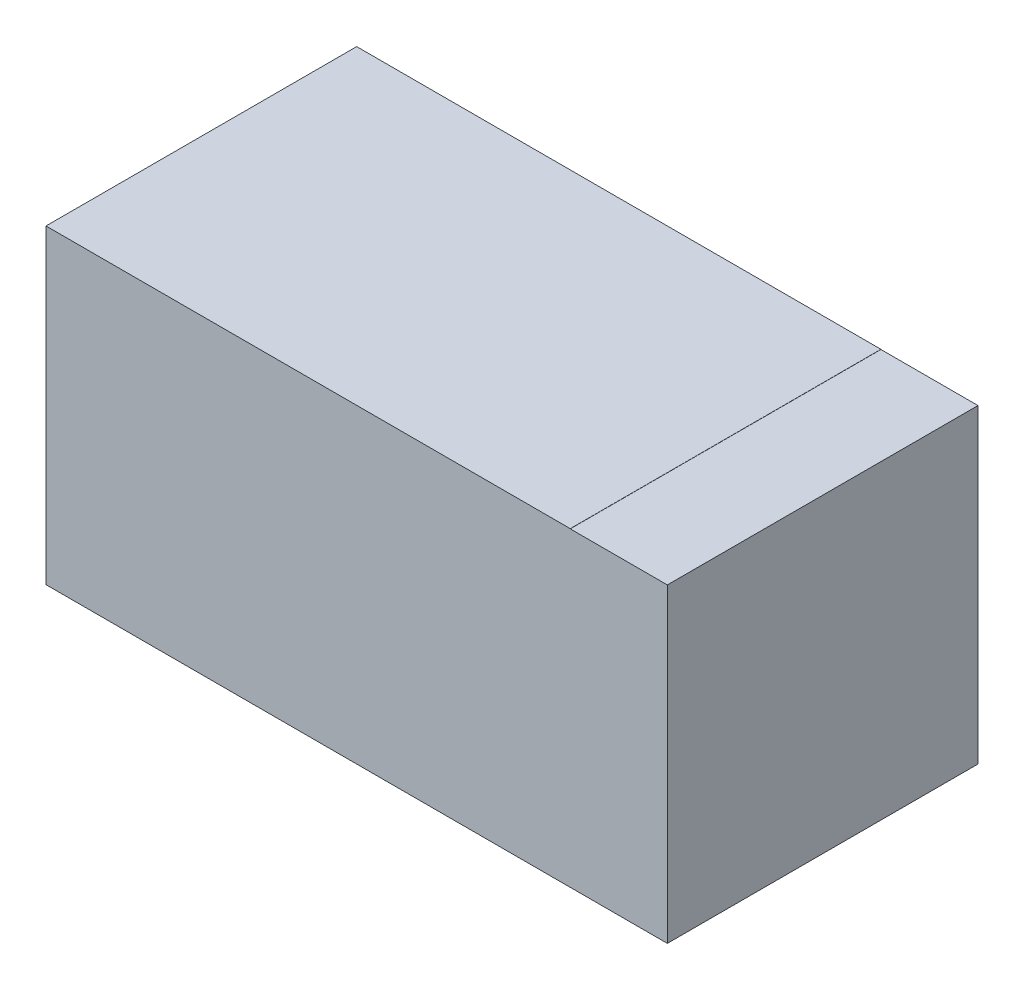
ISO-10303-21;
HEADER;
FILE_DESCRIPTION(('STEP AP214'),'2;1');
FILE_NAME('part.step','',(''),(''),'','','');
FILE_SCHEMA(('AUTOMOTIVE_DESIGN { 1 0 10303 214 1 1 1 1 }'));
ENDSEC;
DATA;
#1=APPLICATION_CONTEXT('core data for automotive mechanical design processes');
#2=APPLICATION_PROTOCOL_DEFINITION('international standard','automotive_design',2000,#1);
#3=PRODUCT_CONTEXT('',#1,'mechanical');
#4=PRODUCT('Part','Part','',(#3));
#5=PRODUCT_RELATED_PRODUCT_CATEGORY('part','',(#4));
#6=PRODUCT_DEFINITION_FORMATION('','',#4);
#7=PRODUCT_DEFINITION_CONTEXT('part definition',#1,'design');
#8=PRODUCT_DEFINITION('design','',#6,#7);
#9=PRODUCT_DEFINITION_SHAPE('','',#8);
#10=(LENGTH_UNIT() NAMED_UNIT(*) SI_UNIT(.MILLI.,.METRE.));
#11=(NAMED_UNIT(*) PLANE_ANGLE_UNIT() SI_UNIT($,.RADIAN.));
#12=(NAMED_UNIT(*) SI_UNIT($,.STERADIAN.) SOLID_ANGLE_UNIT());
#13=UNCERTAINTY_MEASURE_WITH_UNIT(LENGTH_MEASURE(1.E-05),#10,'distance_accuracy_value','');
#14=(GEOMETRIC_REPRESENTATION_CONTEXT(3) GLOBAL_UNCERTAINTY_ASSIGNED_CONTEXT((#13)) GLOBAL_UNIT_ASSIGNED_CONTEXT((#10,
#11,#12)) REPRESENTATION_CONTEXT('',''));
#15=CARTESIAN_POINT('',(0.,0.,0.));
#16=DIRECTION('',(0.,0.,1.));
#17=DIRECTION('',(1.,0.,0.));
#18=AXIS2_PLACEMENT_3D('',#15,#16,#17);
#19=CARTESIAN_POINT('',(-1.6,1.6,-0.8));
#20=DIRECTION('',(1.,0.,0.));
#21=DIRECTION('',(0.,0.,-1.));
#22=AXIS2_PLACEMENT_3D('',#19,#20,#21);
#23=PLANE('',#22);
#24=DIRECTION('',(0.,0.,1.));
#25=VECTOR('',#24,1.);
#26=CARTESIAN_POINT('',(-1.6,0.,-0.8));
#27=LINE('',#26,#25);
#28=CARTESIAN_POINT('',(-1.6,0.,-0.8));
#29=VERTEX_POINT('',#28);
#30=CARTESIAN_POINT('',(-1.6,0.,0.8));
#31=VERTEX_POINT('',#30);
#32=EDGE_CURVE('E94',#29,#31,#27,.T.);
#33=ORIENTED_EDGE('',*,*,#32,.T.);
#34=DIRECTION('',(0.,-1.,0.));
#35=VECTOR('',#34,1.);
#36=CARTESIAN_POINT('',(-1.6,1.6,0.8));
#37=LINE('',#36,#35);
#38=CARTESIAN_POINT('',(-1.6,1.6,0.8));
#39=VERTEX_POINT('',#38);
#40=EDGE_CURVE('E11',#39,#31,#37,.T.);
#41=ORIENTED_EDGE('',*,*,#40,.F.);
#42=DIRECTION('',(0.,0.,1.));
#43=VECTOR('',#42,1.);
#44=CARTESIAN_POINT('',(-1.6,1.6,-0.8));
#45=LINE('',#44,#43);
#46=CARTESIAN_POINT('',(-1.6,1.6,-0.8));
#47=VERTEX_POINT('',#46);
#48=EDGE_CURVE('E88',#47,#39,#45,.T.);
#49=ORIENTED_EDGE('',*,*,#48,.F.);
#50=DIRECTION('',(0.,-1.,0.));
#51=VECTOR('',#50,1.);
#52=CARTESIAN_POINT('',(-1.6,1.6,-0.8));
#53=LINE('',#52,#51);
#54=EDGE_CURVE('E79',#47,#29,#53,.T.);
#55=ORIENTED_EDGE('',*,*,#54,.T.);
#56=EDGE_LOOP('',(#33,#41,#49,#55));
#57=FACE_BOUND('',#56,.T.);
#58=ADVANCED_FACE('F35',(#57),#23,.F.);
#59=CARTESIAN_POINT('',(1.6,1.6,0.8));
#60=DIRECTION('',(0.,0.,-1.));
#61=DIRECTION('',(-1.,0.,0.));
#62=AXIS2_PLACEMENT_3D('',#59,#60,#61);
#63=PLANE('',#62);
#64=DIRECTION('',(1.,0.,0.));
#65=VECTOR('',#64,1.);
#66=CARTESIAN_POINT('',(1.6,1.599,0.8));
#67=LINE('',#66,#65);
#68=CARTESIAN_POINT('',(1.1,1.599,0.8));
#69=VERTEX_POINT('',#68);
#70=CARTESIAN_POINT('',(1.6,1.599,0.8));
#71=VERTEX_POINT('',#70);
#72=EDGE_CURVE('E124',#69,#71,#67,.T.);
#73=ORIENTED_EDGE('',*,*,#72,.F.);
#74=DIRECTION('',(0.,1.,0.));
#75=VECTOR('',#74,1.);
#76=CARTESIAN_POINT('',(1.1,1.599,0.8));
#77=LINE('',#76,#75);
#78=CARTESIAN_POINT('',(1.1,1.6,0.8));
#79=VERTEX_POINT('',#78);
#80=EDGE_CURVE('E99',#69,#79,#77,.T.);
#81=ORIENTED_EDGE('',*,*,#80,.T.);
#82=DIRECTION('',(1.,0.,0.));
#83=VECTOR('',#82,1.);
#84=CARTESIAN_POINT('',(1.6,1.6,0.8));
#85=LINE('',#84,#83);
#86=EDGE_CURVE('E118',#39,#79,#85,.T.);
#87=ORIENTED_EDGE('',*,*,#86,.F.);
#88=ORIENTED_EDGE('',*,*,#40,.T.);
#89=DIRECTION('',(1.,0.,0.));
#90=VECTOR('',#89,1.);
#91=CARTESIAN_POINT('',(1.6,0.,0.8));
#92=LINE('',#91,#90);
#93=CARTESIAN_POINT('',(1.6,0.,0.8));
#94=VERTEX_POINT('',#93);
#95=EDGE_CURVE('E98',#31,#94,#92,.T.);
#96=ORIENTED_EDGE('',*,*,#95,.T.);
#97=DIRECTION('',(0.,-1.,0.));
#98=VECTOR('',#97,1.);
#99=CARTESIAN_POINT('',(1.6,1.6,0.8));
#100=LINE('',#99,#98);
#101=EDGE_CURVE('E42',#71,#94,#100,.T.);
#102=ORIENTED_EDGE('',*,*,#101,.F.);
#103=EDGE_LOOP('',(#73,#81,#87,#88,#96,#102));
#104=FACE_BOUND('',#103,.T.);
#105=ADVANCED_FACE('F116',(#104),#63,.F.);
#106=CARTESIAN_POINT('',(1.6,1.6,-0.8));
#107=DIRECTION('',(-1.,0.,0.));
#108=DIRECTION('',(0.,0.,1.));
#109=AXIS2_PLACEMENT_3D('',#106,#107,#108);
#110=PLANE('',#109);
#111=DIRECTION('',(0.,-1.,0.));
#112=VECTOR('',#111,1.);
#113=CARTESIAN_POINT('',(1.6,1.6,-0.8));
#114=LINE('',#113,#112);
#115=CARTESIAN_POINT('',(1.6,1.599,-0.8));
#116=VERTEX_POINT('',#115);
#117=CARTESIAN_POINT('',(1.6,0.,-0.8));
#118=VERTEX_POINT('',#117);
#119=EDGE_CURVE('E83',#116,#118,#114,.T.);
#120=ORIENTED_EDGE('',*,*,#119,.F.);
#121=DIRECTION('',(0.,0.,-1.));
#122=VECTOR('',#121,1.);
#123=CARTESIAN_POINT('',(1.6,1.599,-0.8));
#124=LINE('',#123,#122);
#125=EDGE_CURVE('E113',#71,#116,#124,.T.);
#126=ORIENTED_EDGE('',*,*,#125,.F.);
#127=ORIENTED_EDGE('',*,*,#101,.T.);
#128=DIRECTION('',(0.,0.,-1.));
#129=VECTOR('',#128,1.);
#130=CARTESIAN_POINT('',(1.6,0.,-0.8));
#131=LINE('',#130,#129);
#132=EDGE_CURVE('E89',#94,#118,#131,.T.);
#133=ORIENTED_EDGE('',*,*,#132,.T.);
#134=EDGE_LOOP('',(#120,#126,#127,#133));
#135=FACE_BOUND('',#134,.T.);
#136=ADVANCED_FACE('F111',(#135),#110,.F.);
#137=CARTESIAN_POINT('',(1.6,1.6,-0.8));
#138=DIRECTION('',(0.,0.,1.));
#139=DIRECTION('',(1.,0.,0.));
#140=AXIS2_PLACEMENT_3D('',#137,#138,#139);
#141=PLANE('',#140);
#142=DIRECTION('',(-1.,0.,0.));
#143=VECTOR('',#142,1.);
#144=CARTESIAN_POINT('',(1.6,1.6,-0.8));
#145=LINE('',#144,#143);
#146=CARTESIAN_POINT('',(1.1,1.6,-0.8));
#147=VERTEX_POINT('',#146);
#148=EDGE_CURVE('E57',#147,#47,#145,.T.);
#149=ORIENTED_EDGE('',*,*,#148,.F.);
#150=DIRECTION('',(0.,1.,0.));
#151=VECTOR('',#150,1.);
#152=CARTESIAN_POINT('',(1.1,1.599,-0.8));
#153=LINE('',#152,#151);
#154=CARTESIAN_POINT('',(1.1,1.599,-0.8));
#155=VERTEX_POINT('',#154);
#156=EDGE_CURVE('E49',#155,#147,#153,.T.);
#157=ORIENTED_EDGE('',*,*,#156,.F.);
#158=DIRECTION('',(-1.,0.,0.));
#159=VECTOR('',#158,1.);
#160=CARTESIAN_POINT('',(1.6,1.599,-0.8));
#161=LINE('',#160,#159);
#162=EDGE_CURVE('E133',#116,#155,#161,.T.);
#163=ORIENTED_EDGE('',*,*,#162,.F.);
#164=ORIENTED_EDGE('',*,*,#119,.T.);
#165=DIRECTION('',(-1.,0.,0.));
#166=VECTOR('',#165,1.);
#167=CARTESIAN_POINT('',(1.6,0.,-0.8));
#168=LINE('',#167,#166);
#169=EDGE_CURVE('E76',#118,#29,#168,.T.);
#170=ORIENTED_EDGE('',*,*,#169,.T.);
#171=ORIENTED_EDGE('',*,*,#54,.F.);
#172=EDGE_LOOP('',(#149,#157,#163,#164,#170,#171));
#173=FACE_BOUND('',#172,.T.);
#174=ADVANCED_FACE('F78',(#173),#141,.F.);
#175=CARTESIAN_POINT('',(0.,1.6,0.));
#176=DIRECTION('',(0.,-1.,0.));
#177=DIRECTION('',(0.,0.,-1.));
#178=AXIS2_PLACEMENT_3D('',#175,#176,#177);
#179=PLANE('',#178);
#180=ORIENTED_EDGE('',*,*,#86,.T.);
#181=DIRECTION('',(0.,0.,1.));
#182=VECTOR('',#181,1.);
#183=CARTESIAN_POINT('',(1.1,1.6,-0.8));
#184=LINE('',#183,#182);
#185=EDGE_CURVE('E126',#147,#79,#184,.T.);
#186=ORIENTED_EDGE('',*,*,#185,.F.);
#187=ORIENTED_EDGE('',*,*,#148,.T.);
#188=ORIENTED_EDGE('',*,*,#48,.T.);
#189=EDGE_LOOP('',(#180,#186,#187,#188));
#190=FACE_BOUND('',#189,.T.);
#191=ADVANCED_FACE('F121',(#190),#179,.F.);
#192=CARTESIAN_POINT('',(0.,0.,0.));
#193=DIRECTION('',(0.,-1.,0.));
#194=DIRECTION('',(0.,0.,-1.));
#195=AXIS2_PLACEMENT_3D('',#192,#193,#194);
#196=PLANE('',#195);
#197=ORIENTED_EDGE('',*,*,#32,.F.);
#198=ORIENTED_EDGE('',*,*,#169,.F.);
#199=ORIENTED_EDGE('',*,*,#132,.F.);
#200=ORIENTED_EDGE('',*,*,#95,.F.);
#201=EDGE_LOOP('',(#197,#198,#199,#200));
#202=FACE_BOUND('',#201,.T.);
#203=ADVANCED_FACE('F96',(#202),#196,.T.);
#204=CARTESIAN_POINT('',(1.1,1.599,-0.8));
#205=DIRECTION('',(-1.,0.,0.));
#206=DIRECTION('',(0.,0.,1.));
#207=AXIS2_PLACEMENT_3D('',#204,#205,#206);
#208=PLANE('',#207);
#209=ORIENTED_EDGE('',*,*,#185,.T.);
#210=ORIENTED_EDGE('',*,*,#80,.F.);
#211=DIRECTION('',(0.,0.,1.));
#212=VECTOR('',#211,1.);
#213=CARTESIAN_POINT('',(1.1,1.599,-0.8));
#214=LINE('',#213,#212);
#215=EDGE_CURVE('E130',#155,#69,#214,.T.);
#216=ORIENTED_EDGE('',*,*,#215,.F.);
#217=ORIENTED_EDGE('',*,*,#156,.T.);
#218=EDGE_LOOP('',(#209,#210,#216,#217));
#219=FACE_BOUND('',#218,.T.);
#220=ADVANCED_FACE('F145',(#219),#208,.F.);
#221=CARTESIAN_POINT('',(0.,1.599,0.));
#222=DIRECTION('',(0.,-1.,0.));
#223=DIRECTION('',(0.,0.,-1.));
#224=AXIS2_PLACEMENT_3D('',#221,#222,#223);
#225=PLANE('',#224);
#226=ORIENTED_EDGE('',*,*,#125,.T.);
#227=ORIENTED_EDGE('',*,*,#162,.T.);
#228=ORIENTED_EDGE('',*,*,#215,.T.);
#229=ORIENTED_EDGE('',*,*,#72,.T.);
#230=EDGE_LOOP('',(#226,#227,#228,#229));
#231=FACE_BOUND('',#230,.T.);
#232=ADVANCED_FACE('F138',(#231),#225,.F.);
#233=CLOSED_SHELL('',(#58,#105,#136,#174,#191,#203,#220,#232));
#234=MANIFOLD_SOLID_BREP('B2',#233);
#235=ADVANCED_BREP_SHAPE_REPRESENTATION('',(#18,#234),#14);
#236=SHAPE_DEFINITION_REPRESENTATION(#9,#235);
ENDSEC;
END-ISO-10303-21;
